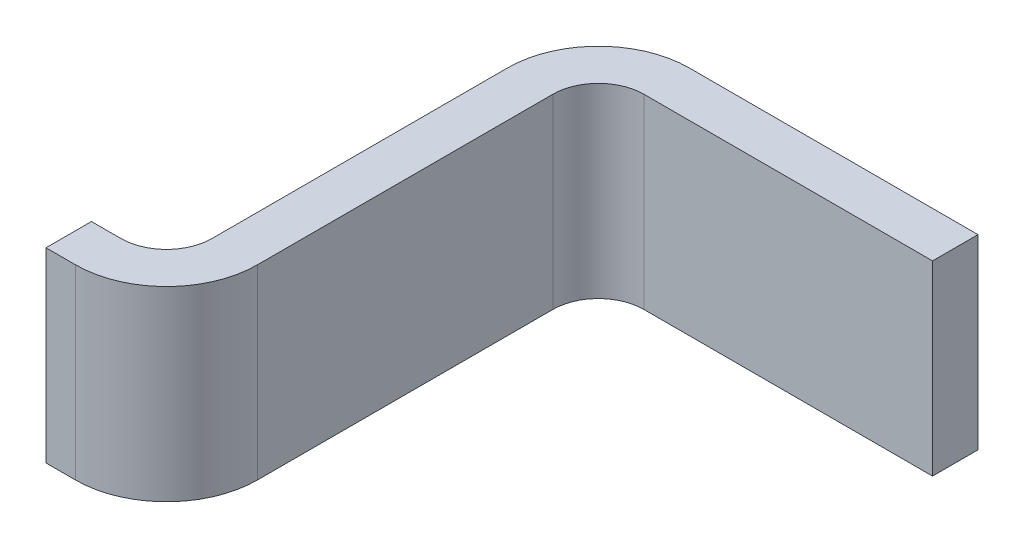
ISO-10303-21;
HEADER;
FILE_DESCRIPTION(('STEP AP214'),'2;1');
FILE_NAME('part.step','',(''),(''),'','','');
FILE_SCHEMA(('AUTOMOTIVE_DESIGN { 1 0 10303 214 1 1 1 1 }'));
ENDSEC;
DATA;
#1=APPLICATION_CONTEXT('core data for automotive mechanical design processes');
#2=APPLICATION_PROTOCOL_DEFINITION('international standard','automotive_design',2000,#1);
#3=PRODUCT_CONTEXT('',#1,'mechanical');
#4=PRODUCT('Part','Part','',(#3));
#5=PRODUCT_RELATED_PRODUCT_CATEGORY('part','',(#4));
#6=PRODUCT_DEFINITION_FORMATION('','',#4);
#7=PRODUCT_DEFINITION_CONTEXT('part definition',#1,'design');
#8=PRODUCT_DEFINITION('design','',#6,#7);
#9=PRODUCT_DEFINITION_SHAPE('','',#8);
#10=(LENGTH_UNIT() NAMED_UNIT(*) SI_UNIT(.MILLI.,.METRE.));
#11=(NAMED_UNIT(*) PLANE_ANGLE_UNIT() SI_UNIT($,.RADIAN.));
#12=(NAMED_UNIT(*) SI_UNIT($,.STERADIAN.) SOLID_ANGLE_UNIT());
#13=UNCERTAINTY_MEASURE_WITH_UNIT(LENGTH_MEASURE(1.E-05),#10,'distance_accuracy_value','');
#14=(GEOMETRIC_REPRESENTATION_CONTEXT(3) GLOBAL_UNCERTAINTY_ASSIGNED_CONTEXT((#13)) GLOBAL_UNIT_ASSIGNED_CONTEXT((#10,
#11,#12)) REPRESENTATION_CONTEXT('',''));
#15=CARTESIAN_POINT('',(0.,0.,0.));
#16=DIRECTION('',(0.,0.,1.));
#17=DIRECTION('',(1.,0.,0.));
#18=AXIS2_PLACEMENT_3D('',#15,#16,#17);
#19=CARTESIAN_POINT('',(0.,0.205,1.05));
#20=DIRECTION('',(0.,0.,-1.));
#21=DIRECTION('',(-1.,0.,0.));
#22=AXIS2_PLACEMENT_3D('',#19,#20,#21);
#23=PLANE('',#22);
#24=DIRECTION('',(1.,0.,0.));
#25=VECTOR('',#24,1.);
#26=CARTESIAN_POINT('',(0.,0.205,1.05));
#27=LINE('',#26,#25);
#28=CARTESIAN_POINT('',(0.065,0.205,1.05));
#29=VERTEX_POINT('',#28);
#30=CARTESIAN_POINT('',(0.,0.205,1.05));
#31=VERTEX_POINT('',#30);
#32=EDGE_CURVE('E85',#29,#31,#27,.F.);
#33=ORIENTED_EDGE('',*,*,#32,.T.);
#34=DIRECTION('',(0.,1.,0.));
#35=VECTOR('',#34,1.);
#36=CARTESIAN_POINT('',(0.,-0.205,1.05));
#37=LINE('',#36,#35);
#38=CARTESIAN_POINT('',(0.,-0.205,1.05));
#39=VERTEX_POINT('',#38);
#40=EDGE_CURVE('E111',#39,#31,#37,.T.);
#41=ORIENTED_EDGE('',*,*,#40,.F.);
#42=DIRECTION('',(1.,0.,0.));
#43=VECTOR('',#42,1.);
#44=CARTESIAN_POINT('',(0.,-0.205,1.05));
#45=LINE('',#44,#43);
#46=CARTESIAN_POINT('',(0.065,-0.205,1.05));
#47=VERTEX_POINT('',#46);
#48=EDGE_CURVE('E130',#39,#47,#45,.T.);
#49=ORIENTED_EDGE('',*,*,#48,.T.);
#50=DIRECTION('',(0.,1.,0.));
#51=VECTOR('',#50,1.);
#52=CARTESIAN_POINT('',(0.065,0.205,1.05));
#53=LINE('',#52,#51);
#54=EDGE_CURVE('E121',#29,#47,#53,.F.);
#55=ORIENTED_EDGE('',*,*,#54,.F.);
#56=EDGE_LOOP('',(#33,#41,#49,#55));
#57=FACE_BOUND('',#56,.T.);
#58=ADVANCED_FACE('F17',(#57),#23,.F.);
#59=CARTESIAN_POINT('',(0.365,0.205,0.1));
#60=DIRECTION('',(0.,0.,-1.));
#61=DIRECTION('',(-1.,0.,0.));
#62=AXIS2_PLACEMENT_3D('',#59,#60,#61);
#63=PLANE('',#62);
#64=DIRECTION('',(1.,0.,0.));
#65=VECTOR('',#64,1.);
#66=CARTESIAN_POINT('',(0.365,0.205,0.1));
#67=LINE('',#66,#65);
#68=CARTESIAN_POINT('',(1.,0.205,0.1));
#69=VERTEX_POINT('',#68);
#70=CARTESIAN_POINT('',(0.365,0.205,0.1));
#71=VERTEX_POINT('',#70);
#72=EDGE_CURVE('E142',#69,#71,#67,.F.);
#73=ORIENTED_EDGE('',*,*,#72,.T.);
#74=DIRECTION('',(0.,-1.,0.));
#75=VECTOR('',#74,1.);
#76=CARTESIAN_POINT('',(0.365,0.205,0.1));
#77=LINE('',#76,#75);
#78=CARTESIAN_POINT('',(0.365,-0.205,0.1));
#79=VERTEX_POINT('',#78);
#80=EDGE_CURVE('E189',#71,#79,#77,.T.);
#81=ORIENTED_EDGE('',*,*,#80,.T.);
#82=DIRECTION('',(1.,0.,0.));
#83=VECTOR('',#82,1.);
#84=CARTESIAN_POINT('',(0.365,-0.205,0.1));
#85=LINE('',#84,#83);
#86=CARTESIAN_POINT('',(1.,-0.205,0.1));
#87=VERTEX_POINT('',#86);
#88=EDGE_CURVE('E193',#79,#87,#85,.T.);
#89=ORIENTED_EDGE('',*,*,#88,.T.);
#90=DIRECTION('',(0.,1.,0.));
#91=VECTOR('',#90,1.);
#92=CARTESIAN_POINT('',(1.,-0.205,0.1));
#93=LINE('',#92,#91);
#94=EDGE_CURVE('E96',#87,#69,#93,.T.);
#95=ORIENTED_EDGE('',*,*,#94,.T.);
#96=EDGE_LOOP('',(#73,#81,#89,#95));
#97=FACE_BOUND('',#96,.T.);
#98=ADVANCED_FACE('F230',(#97),#63,.F.);
#99=CARTESIAN_POINT('',(0.,-0.205,0.95));
#100=DIRECTION('',(-1.,0.,0.));
#101=DIRECTION('',(0.,0.,1.));
#102=AXIS2_PLACEMENT_3D('',#99,#100,#101);
#103=PLANE('',#102);
#104=DIRECTION('',(0.,0.,1.));
#105=VECTOR('',#104,1.);
#106=CARTESIAN_POINT('',(0.,0.205,0.95));
#107=LINE('',#106,#105);
#108=CARTESIAN_POINT('',(0.,0.205,0.95));
#109=VERTEX_POINT('',#108);
#110=EDGE_CURVE('E114',#31,#109,#107,.F.);
#111=ORIENTED_EDGE('',*,*,#110,.T.);
#112=DIRECTION('',(0.,1.,0.));
#113=VECTOR('',#112,1.);
#114=CARTESIAN_POINT('',(0.,-0.205,0.95));
#115=LINE('',#114,#113);
#116=CARTESIAN_POINT('',(0.,-0.205,0.95));
#117=VERTEX_POINT('',#116);
#118=EDGE_CURVE('E175',#109,#117,#115,.F.);
#119=ORIENTED_EDGE('',*,*,#118,.T.);
#120=DIRECTION('',(0.,0.,1.));
#121=VECTOR('',#120,1.);
#122=CARTESIAN_POINT('',(0.,-0.205,1.05));
#123=LINE('',#122,#121);
#124=EDGE_CURVE('E116',#117,#39,#123,.T.);
#125=ORIENTED_EDGE('',*,*,#124,.T.);
#126=ORIENTED_EDGE('',*,*,#40,.T.);
#127=EDGE_LOOP('',(#111,#119,#125,#126));
#128=FACE_BOUND('',#127,.T.);
#129=ADVANCED_FACE('F112',(#128),#103,.T.);
#130=CARTESIAN_POINT('',(0.065,0.205,0.85));
#131=DIRECTION('',(0.,1.,0.));
#132=DIRECTION('',(0.,0.,1.));
#133=AXIS2_PLACEMENT_3D('',#130,#131,#132);
#134=CYLINDRICAL_SURFACE('',#133,0.2);
#135=CARTESIAN_POINT('',(0.065,0.205,0.85));
#136=DIRECTION('',(0.,1.,0.));
#137=DIRECTION('',(0.,0.,1.));
#138=AXIS2_PLACEMENT_3D('',#135,#136,#137);
#139=CIRCLE('',#138,0.2);
#140=CARTESIAN_POINT('',(0.265,0.205,0.85));
#141=VERTEX_POINT('',#140);
#142=EDGE_CURVE('E20',#29,#141,#139,.T.);
#143=ORIENTED_EDGE('',*,*,#142,.F.);
#144=ORIENTED_EDGE('',*,*,#54,.T.);
#145=CARTESIAN_POINT('',(0.065,-0.205,0.85));
#146=DIRECTION('',(0.,1.,0.));
#147=DIRECTION('',(0.,0.,1.));
#148=AXIS2_PLACEMENT_3D('',#145,#146,#147);
#149=CIRCLE('',#148,0.2);
#150=CARTESIAN_POINT('',(0.265,-0.205,0.85));
#151=VERTEX_POINT('',#150);
#152=EDGE_CURVE('E166',#151,#47,#149,.F.);
#153=ORIENTED_EDGE('',*,*,#152,.F.);
#154=DIRECTION('',(0.,1.,0.));
#155=VECTOR('',#154,1.);
#156=CARTESIAN_POINT('',(0.265,0.205,0.85));
#157=LINE('',#156,#155);
#158=EDGE_CURVE('E168',#151,#141,#157,.T.);
#159=ORIENTED_EDGE('',*,*,#158,.T.);
#160=EDGE_LOOP('',(#143,#144,#153,#159));
#161=FACE_BOUND('',#160,.T.);
#162=ADVANCED_FACE('F220',(#161),#134,.T.);
#163=CARTESIAN_POINT('',(1.,-0.205,0.));
#164=DIRECTION('',(-1.,0.,0.));
#165=DIRECTION('',(0.,0.,1.));
#166=AXIS2_PLACEMENT_3D('',#163,#164,#165);
#167=PLANE('',#166);
#168=DIRECTION('',(0.,0.,1.));
#169=VECTOR('',#168,1.);
#170=CARTESIAN_POINT('',(1.,0.205,0.));
#171=LINE('',#170,#169);
#172=CARTESIAN_POINT('',(1.,0.205,0.));
#173=VERTEX_POINT('',#172);
#174=EDGE_CURVE('E141',#69,#173,#171,.F.);
#175=ORIENTED_EDGE('',*,*,#174,.F.);
#176=ORIENTED_EDGE('',*,*,#94,.F.);
#177=DIRECTION('',(0.,0.,1.));
#178=VECTOR('',#177,1.);
#179=CARTESIAN_POINT('',(1.,-0.205,0.1));
#180=LINE('',#179,#178);
#181=CARTESIAN_POINT('',(1.,-0.205,0.));
#182=VERTEX_POINT('',#181);
#183=EDGE_CURVE('E192',#87,#182,#180,.F.);
#184=ORIENTED_EDGE('',*,*,#183,.T.);
#185=DIRECTION('',(0.,1.,0.));
#186=VECTOR('',#185,1.);
#187=CARTESIAN_POINT('',(1.,-0.205,0.));
#188=LINE('',#187,#186);
#189=EDGE_CURVE('E161',#182,#173,#188,.T.);
#190=ORIENTED_EDGE('',*,*,#189,.T.);
#191=EDGE_LOOP('',(#175,#176,#184,#190));
#192=FACE_BOUND('',#191,.T.);
#193=ADVANCED_FACE('F232',(#192),#167,.F.);
#194=CARTESIAN_POINT('',(0.365,0.205,0.2));
#195=DIRECTION('',(0.,-1.,0.));
#196=DIRECTION('',(0.,0.,-1.));
#197=AXIS2_PLACEMENT_3D('',#194,#195,#196);
#198=CYLINDRICAL_SURFACE('',#197,0.1);
#199=CARTESIAN_POINT('',(0.365,0.205,0.2));
#200=DIRECTION('',(0.,-1.,0.));
#201=DIRECTION('',(0.,0.,-1.));
#202=AXIS2_PLACEMENT_3D('',#199,#200,#201);
#203=CIRCLE('',#202,0.1);
#204=CARTESIAN_POINT('',(0.265,0.205,0.2));
#205=VERTEX_POINT('',#204);
#206=EDGE_CURVE('E162',#205,#71,#203,.T.);
#207=ORIENTED_EDGE('',*,*,#206,.F.);
#208=DIRECTION('',(0.,1.,0.));
#209=VECTOR('',#208,1.);
#210=CARTESIAN_POINT('',(0.265,0.205,0.2));
#211=LINE('',#210,#209);
#212=CARTESIAN_POINT('',(0.265,-0.205,0.2));
#213=VERTEX_POINT('',#212);
#214=EDGE_CURVE('E165',#205,#213,#211,.F.);
#215=ORIENTED_EDGE('',*,*,#214,.T.);
#216=CARTESIAN_POINT('',(0.365,-0.205,0.2));
#217=DIRECTION('',(0.,-1.,0.));
#218=DIRECTION('',(0.,0.,-1.));
#219=AXIS2_PLACEMENT_3D('',#216,#217,#218);
#220=CIRCLE('',#219,0.1);
#221=EDGE_CURVE('E159',#79,#213,#220,.F.);
#222=ORIENTED_EDGE('',*,*,#221,.F.);
#223=ORIENTED_EDGE('',*,*,#80,.F.);
#224=EDGE_LOOP('',(#207,#215,#222,#223));
#225=FACE_BOUND('',#224,.T.);
#226=ADVANCED_FACE('F226',(#225),#198,.F.);
#227=CARTESIAN_POINT('',(0.,-0.205,0.95));
#228=DIRECTION('',(0.,0.,1.));
#229=DIRECTION('',(1.,0.,0.));
#230=AXIS2_PLACEMENT_3D('',#227,#228,#229);
#231=PLANE('',#230);
#232=DIRECTION('',(1.,0.,0.));
#233=VECTOR('',#232,1.);
#234=CARTESIAN_POINT('',(0.,-0.205,0.95));
#235=LINE('',#234,#233);
#236=CARTESIAN_POINT('',(0.065,-0.205,0.95));
#237=VERTEX_POINT('',#236);
#238=EDGE_CURVE('E169',#117,#237,#235,.T.);
#239=ORIENTED_EDGE('',*,*,#238,.F.);
#240=ORIENTED_EDGE('',*,*,#118,.F.);
#241=DIRECTION('',(1.,0.,0.));
#242=VECTOR('',#241,1.);
#243=CARTESIAN_POINT('',(0.,0.205,0.95));
#244=LINE('',#243,#242);
#245=CARTESIAN_POINT('',(0.065,0.205,0.95));
#246=VERTEX_POINT('',#245);
#247=EDGE_CURVE('E128',#246,#109,#244,.F.);
#248=ORIENTED_EDGE('',*,*,#247,.F.);
#249=DIRECTION('',(0.,1.,0.));
#250=VECTOR('',#249,1.);
#251=CARTESIAN_POINT('',(0.065,-0.205,0.95));
#252=LINE('',#251,#250);
#253=EDGE_CURVE('E155',#246,#237,#252,.F.);
#254=ORIENTED_EDGE('',*,*,#253,.T.);
#255=EDGE_LOOP('',(#239,#240,#248,#254));
#256=FACE_BOUND('',#255,.T.);
#257=ADVANCED_FACE('F266',(#256),#231,.F.);
#258=CARTESIAN_POINT('',(0.265,0.205,0.85));
#259=DIRECTION('',(-1.,0.,0.));
#260=DIRECTION('',(0.,0.,1.));
#261=AXIS2_PLACEMENT_3D('',#258,#259,#260);
#262=PLANE('',#261);
#263=DIRECTION('',(0.,0.,-1.));
#264=VECTOR('',#263,1.);
#265=CARTESIAN_POINT('',(0.265,0.205,0.85));
#266=LINE('',#265,#264);
#267=EDGE_CURVE('E158',#205,#141,#266,.F.);
#268=ORIENTED_EDGE('',*,*,#267,.T.);
#269=ORIENTED_EDGE('',*,*,#158,.F.);
#270=DIRECTION('',(0.,0.,1.));
#271=VECTOR('',#270,1.);
#272=CARTESIAN_POINT('',(0.265,-0.205,0.85));
#273=LINE('',#272,#271);
#274=EDGE_CURVE('E152',#151,#213,#273,.F.);
#275=ORIENTED_EDGE('',*,*,#274,.T.);
#276=ORIENTED_EDGE('',*,*,#214,.F.);
#277=EDGE_LOOP('',(#268,#269,#275,#276));
#278=FACE_BOUND('',#277,.T.);
#279=ADVANCED_FACE('F268',(#278),#262,.F.);
#280=CARTESIAN_POINT('',(0.365,-0.205,0.));
#281=DIRECTION('',(0.,0.,1.));
#282=DIRECTION('',(1.,0.,0.));
#283=AXIS2_PLACEMENT_3D('',#280,#281,#282);
#284=PLANE('',#283);
#285=DIRECTION('',(1.,0.,0.));
#286=VECTOR('',#285,1.);
#287=CARTESIAN_POINT('',(0.365,-0.205,0.));
#288=LINE('',#287,#286);
#289=CARTESIAN_POINT('',(0.365,-0.205,0.));
#290=VERTEX_POINT('',#289);
#291=EDGE_CURVE('E203',#290,#182,#288,.T.);
#292=ORIENTED_EDGE('',*,*,#291,.F.);
#293=DIRECTION('',(0.,-1.,0.));
#294=VECTOR('',#293,1.);
#295=CARTESIAN_POINT('',(0.365,-0.205,0.));
#296=LINE('',#295,#294);
#297=CARTESIAN_POINT('',(0.365,0.205,0.));
#298=VERTEX_POINT('',#297);
#299=EDGE_CURVE('E149',#298,#290,#296,.T.);
#300=ORIENTED_EDGE('',*,*,#299,.F.);
#301=DIRECTION('',(1.,0.,0.));
#302=VECTOR('',#301,1.);
#303=CARTESIAN_POINT('',(0.365,0.205,0.));
#304=LINE('',#303,#302);
#305=EDGE_CURVE('E164',#173,#298,#304,.F.);
#306=ORIENTED_EDGE('',*,*,#305,.F.);
#307=ORIENTED_EDGE('',*,*,#189,.F.);
#308=EDGE_LOOP('',(#292,#300,#306,#307));
#309=FACE_BOUND('',#308,.T.);
#310=ADVANCED_FACE('F238',(#309),#284,.F.);
#311=CARTESIAN_POINT('',(0.165,0.205,0.85));
#312=DIRECTION('',(0.,-1.,0.));
#313=DIRECTION('',(0.,0.,-1.));
#314=AXIS2_PLACEMENT_3D('',#311,#312,#313);
#315=PLANE('',#314);
#316=DIRECTION('',(0.,0.,-1.));
#317=VECTOR('',#316,1.);
#318=CARTESIAN_POINT('',(0.165,0.205,0.85));
#319=LINE('',#318,#317);
#320=CARTESIAN_POINT('',(0.165,0.205,0.2));
#321=VERTEX_POINT('',#320);
#322=CARTESIAN_POINT('',(0.165,0.205,0.85));
#323=VERTEX_POINT('',#322);
#324=EDGE_CURVE('E148',#321,#323,#319,.F.);
#325=ORIENTED_EDGE('',*,*,#324,.T.);
#326=CARTESIAN_POINT('',(0.065,0.205,0.85));
#327=DIRECTION('',(0.,1.,0.));
#328=DIRECTION('',(0.,0.,1.));
#329=AXIS2_PLACEMENT_3D('',#326,#327,#328);
#330=CIRCLE('',#329,0.1);
#331=EDGE_CURVE('E156',#323,#246,#330,.F.);
#332=ORIENTED_EDGE('',*,*,#331,.T.);
#333=ORIENTED_EDGE('',*,*,#247,.T.);
#334=ORIENTED_EDGE('',*,*,#110,.F.);
#335=ORIENTED_EDGE('',*,*,#32,.F.);
#336=ORIENTED_EDGE('',*,*,#142,.T.);
#337=ORIENTED_EDGE('',*,*,#267,.F.);
#338=ORIENTED_EDGE('',*,*,#206,.T.);
#339=ORIENTED_EDGE('',*,*,#72,.F.);
#340=ORIENTED_EDGE('',*,*,#174,.T.);
#341=ORIENTED_EDGE('',*,*,#305,.T.);
#342=CARTESIAN_POINT('',(0.365,0.205,0.2));
#343=DIRECTION('',(0.,-1.,0.));
#344=DIRECTION('',(0.,0.,-1.));
#345=AXIS2_PLACEMENT_3D('',#342,#343,#344);
#346=CIRCLE('',#345,0.2);
#347=EDGE_CURVE('E150',#321,#298,#346,.T.);
#348=ORIENTED_EDGE('',*,*,#347,.F.);
#349=EDGE_LOOP('',(#325,#332,#333,#334,#335,#336,#337,#338,#339,#340,#341,#348));
#350=FACE_BOUND('',#349,.T.);
#351=ADVANCED_FACE('F126',(#350),#315,.F.);
#352=CARTESIAN_POINT('',(0.065,-0.205,0.85));
#353=DIRECTION('',(0.,1.,0.));
#354=DIRECTION('',(0.,0.,1.));
#355=AXIS2_PLACEMENT_3D('',#352,#353,#354);
#356=CYLINDRICAL_SURFACE('',#355,0.1);
#357=CARTESIAN_POINT('',(0.065,-0.205,0.85));
#358=DIRECTION('',(0.,1.,0.));
#359=DIRECTION('',(0.,0.,1.));
#360=AXIS2_PLACEMENT_3D('',#357,#358,#359);
#361=CIRCLE('',#360,0.1);
#362=CARTESIAN_POINT('',(0.165,-0.205,0.85));
#363=VERTEX_POINT('',#362);
#364=EDGE_CURVE('E153',#237,#363,#361,.T.);
#365=ORIENTED_EDGE('',*,*,#364,.F.);
#366=ORIENTED_EDGE('',*,*,#253,.F.);
#367=ORIENTED_EDGE('',*,*,#331,.F.);
#368=DIRECTION('',(0.,1.,0.));
#369=VECTOR('',#368,1.);
#370=CARTESIAN_POINT('',(0.165,-0.205,0.85));
#371=LINE('',#370,#369);
#372=EDGE_CURVE('E251',#323,#363,#371,.F.);
#373=ORIENTED_EDGE('',*,*,#372,.T.);
#374=EDGE_LOOP('',(#365,#366,#367,#373));
#375=FACE_BOUND('',#374,.T.);
#376=ADVANCED_FACE('F263',(#375),#356,.F.);
#377=CARTESIAN_POINT('',(0.265,-0.205,0.85));
#378=DIRECTION('',(0.,1.,0.));
#379=DIRECTION('',(0.,0.,1.));
#380=AXIS2_PLACEMENT_3D('',#377,#378,#379);
#381=PLANE('',#380);
#382=ORIENTED_EDGE('',*,*,#274,.F.);
#383=ORIENTED_EDGE('',*,*,#152,.T.);
#384=ORIENTED_EDGE('',*,*,#48,.F.);
#385=ORIENTED_EDGE('',*,*,#124,.F.);
#386=ORIENTED_EDGE('',*,*,#238,.T.);
#387=ORIENTED_EDGE('',*,*,#364,.T.);
#388=DIRECTION('',(0.,0.,-1.));
#389=VECTOR('',#388,1.);
#390=CARTESIAN_POINT('',(0.165,-0.205,0.85));
#391=LINE('',#390,#389);
#392=CARTESIAN_POINT('',(0.165,-0.205,0.2));
#393=VERTEX_POINT('',#392);
#394=EDGE_CURVE('E26',#363,#393,#391,.T.);
#395=ORIENTED_EDGE('',*,*,#394,.T.);
#396=CARTESIAN_POINT('',(0.365,-0.205,0.2));
#397=DIRECTION('',(0.,-1.,0.));
#398=DIRECTION('',(0.,0.,-1.));
#399=AXIS2_PLACEMENT_3D('',#396,#397,#398);
#400=CIRCLE('',#399,0.2);
#401=EDGE_CURVE('E34',#290,#393,#400,.F.);
#402=ORIENTED_EDGE('',*,*,#401,.F.);
#403=ORIENTED_EDGE('',*,*,#291,.T.);
#404=ORIENTED_EDGE('',*,*,#183,.F.);
#405=ORIENTED_EDGE('',*,*,#88,.F.);
#406=ORIENTED_EDGE('',*,*,#221,.T.);
#407=EDGE_LOOP('',(#382,#383,#384,#385,#386,#387,#395,#402,#403,#404,#405,#406));
#408=FACE_BOUND('',#407,.T.);
#409=ADVANCED_FACE('F240',(#408),#381,.F.);
#410=CARTESIAN_POINT('',(0.365,-0.205,0.2));
#411=DIRECTION('',(0.,-1.,0.));
#412=DIRECTION('',(0.,0.,-1.));
#413=AXIS2_PLACEMENT_3D('',#410,#411,#412);
#414=CYLINDRICAL_SURFACE('',#413,0.2);
#415=ORIENTED_EDGE('',*,*,#401,.T.);
#416=DIRECTION('',(0.,1.,0.));
#417=VECTOR('',#416,1.);
#418=CARTESIAN_POINT('',(0.165,-0.205,0.2));
#419=LINE('',#418,#417);
#420=EDGE_CURVE('E11',#393,#321,#419,.T.);
#421=ORIENTED_EDGE('',*,*,#420,.T.);
#422=ORIENTED_EDGE('',*,*,#347,.T.);
#423=ORIENTED_EDGE('',*,*,#299,.T.);
#424=EDGE_LOOP('',(#415,#421,#422,#423));
#425=FACE_BOUND('',#424,.T.);
#426=ADVANCED_FACE('F260',(#425),#414,.T.);
#427=CARTESIAN_POINT('',(0.165,-0.205,0.85));
#428=DIRECTION('',(1.,0.,0.));
#429=DIRECTION('',(0.,0.,-1.));
#430=AXIS2_PLACEMENT_3D('',#427,#428,#429);
#431=PLANE('',#430);
#432=ORIENTED_EDGE('',*,*,#394,.F.);
#433=ORIENTED_EDGE('',*,*,#372,.F.);
#434=ORIENTED_EDGE('',*,*,#324,.F.);
#435=ORIENTED_EDGE('',*,*,#420,.F.);
#436=EDGE_LOOP('',(#432,#433,#434,#435));
#437=FACE_BOUND('',#436,.T.);
#438=ADVANCED_FACE('F258',(#437),#431,.F.);
#439=CLOSED_SHELL('',(#58,#98,#129,#162,#193,#226,#257,#279,#310,#351,#376,#409,#426,#438));
#440=MANIFOLD_SOLID_BREP('B1',#439);
#441=ADVANCED_BREP_SHAPE_REPRESENTATION('',(#18,#440),#14);
#442=SHAPE_DEFINITION_REPRESENTATION(#9,#441);
ENDSEC;
END-ISO-10303-21;
